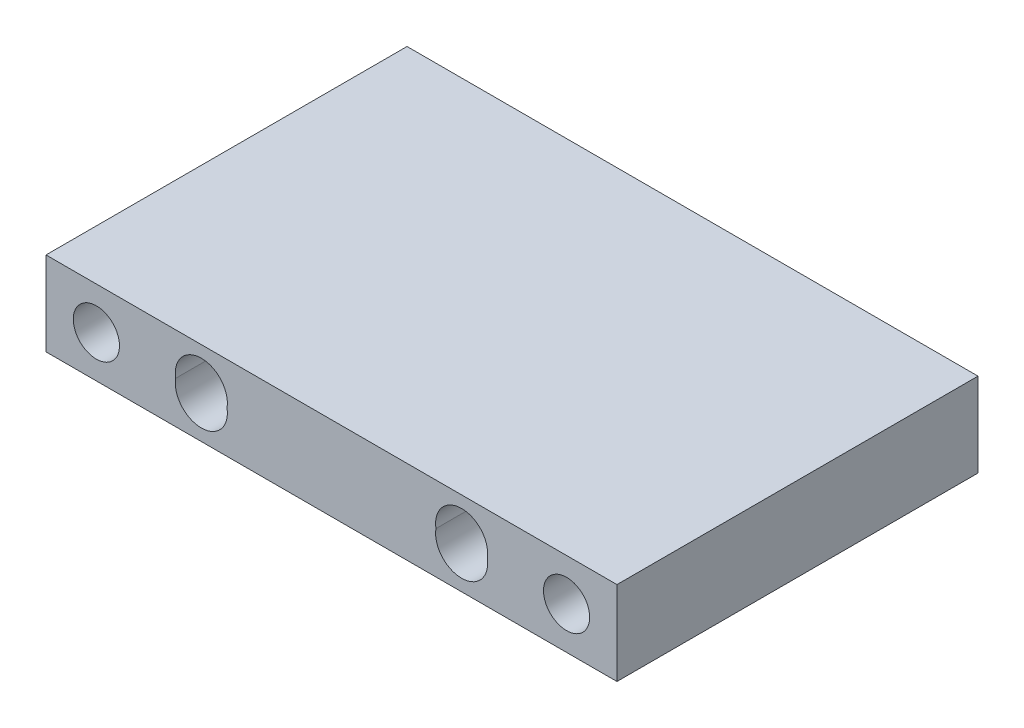
ISO-10303-21;
HEADER;
FILE_DESCRIPTION(('STEP AP214'),'2;1');
FILE_NAME('part.step','',(''),(''),'','','');
FILE_SCHEMA(('AUTOMOTIVE_DESIGN { 1 0 10303 214 1 1 1 1 }'));
ENDSEC;
DATA;
#1=APPLICATION_CONTEXT('core data for automotive mechanical design processes');
#2=APPLICATION_PROTOCOL_DEFINITION('international standard','automotive_design',2000,#1);
#3=PRODUCT_CONTEXT('',#1,'mechanical');
#4=PRODUCT('Part','Part','',(#3));
#5=PRODUCT_RELATED_PRODUCT_CATEGORY('part','',(#4));
#6=PRODUCT_DEFINITION_FORMATION('','',#4);
#7=PRODUCT_DEFINITION_CONTEXT('part definition',#1,'design');
#8=PRODUCT_DEFINITION('design','',#6,#7);
#9=PRODUCT_DEFINITION_SHAPE('','',#8);
#10=(LENGTH_UNIT() NAMED_UNIT(*) SI_UNIT(.MILLI.,.METRE.));
#11=(NAMED_UNIT(*) PLANE_ANGLE_UNIT() SI_UNIT($,.RADIAN.));
#12=(NAMED_UNIT(*) SI_UNIT($,.STERADIAN.) SOLID_ANGLE_UNIT());
#13=UNCERTAINTY_MEASURE_WITH_UNIT(LENGTH_MEASURE(1.E-05),#10,'distance_accuracy_value','');
#14=(GEOMETRIC_REPRESENTATION_CONTEXT(3) GLOBAL_UNCERTAINTY_ASSIGNED_CONTEXT((#13)) GLOBAL_UNIT_ASSIGNED_CONTEXT((#10,
#11,#12)) REPRESENTATION_CONTEXT('',''));
#15=CARTESIAN_POINT('',(0.,0.,0.));
#16=DIRECTION('',(0.,0.,1.));
#17=DIRECTION('',(1.,0.,0.));
#18=AXIS2_PLACEMENT_3D('',#15,#16,#17);
#19=CARTESIAN_POINT('',(28.,0.,-1.));
#20=DIRECTION('',(0.,0.,1.));
#21=DIRECTION('',(1.,0.,0.));
#22=AXIS2_PLACEMENT_3D('',#19,#20,#21);
#23=CYLINDRICAL_SURFACE('',#22,2.75);
#24=CARTESIAN_POINT('',(28.,0.,43.));
#25=DIRECTION('',(0.,0.,1.));
#26=DIRECTION('',(1.,0.,0.));
#27=AXIS2_PLACEMENT_3D('',#24,#25,#26);
#28=CIRCLE('',#27,2.75);
#29=CARTESIAN_POINT('',(30.75,0.,43.));
#30=VERTEX_POINT('',#29);
#31=EDGE_CURVE('E174',#30,#30,#28,.T.);
#32=ORIENTED_EDGE('',*,*,#31,.T.);
#33=EDGE_LOOP('',(#32));
#34=FACE_BOUND('',#33,.T.);
#35=CARTESIAN_POINT('',(28.,0.,0.));
#36=DIRECTION('',(0.,0.,1.));
#37=DIRECTION('',(1.,0.,0.));
#38=AXIS2_PLACEMENT_3D('',#35,#36,#37);
#39=CIRCLE('',#38,2.75);
#40=CARTESIAN_POINT('',(30.75,0.,0.));
#41=VERTEX_POINT('',#40);
#42=EDGE_CURVE('E201',#41,#41,#39,.T.);
#43=ORIENTED_EDGE('',*,*,#42,.F.);
#44=EDGE_LOOP('',(#43));
#45=FACE_BOUND('',#44,.T.);
#46=ADVANCED_FACE('F16',(#34,#45),#23,.F.);
#47=CARTESIAN_POINT('',(15.5,0.5,-1.));
#48=DIRECTION('',(0.,0.,1.));
#49=DIRECTION('',(1.,0.,0.));
#50=AXIS2_PLACEMENT_3D('',#47,#48,#49);
#51=CYLINDRICAL_SURFACE('',#50,3.1);
#52=DIRECTION('',(0.,0.,1.));
#53=VECTOR('',#52,1.);
#54=CARTESIAN_POINT('',(18.559411708156,0.,-1.));
#55=LINE('',#54,#53);
#56=CARTESIAN_POINT('',(18.559411708156,0.,0.));
#57=VERTEX_POINT('',#56);
#58=CARTESIAN_POINT('',(18.559411708156,0.,43.));
#59=VERTEX_POINT('',#58);
#60=EDGE_CURVE('E25',#57,#59,#55,.T.);
#61=ORIENTED_EDGE('',*,*,#60,.T.);
#62=CARTESIAN_POINT('',(15.5,0.5,43.));
#63=DIRECTION('',(0.,0.,-1.));
#64=DIRECTION('',(-0.986907002630809,-0.161290322580969,0.));
#65=AXIS2_PLACEMENT_3D('',#62,#63,#64);
#66=CIRCLE('',#65,3.1);
#67=CARTESIAN_POINT('',(12.440588291844,0.,43.));
#68=VERTEX_POINT('',#67);
#69=EDGE_CURVE('E152',#68,#59,#66,.T.);
#70=ORIENTED_EDGE('',*,*,#69,.F.);
#71=DIRECTION('',(0.,0.,1.));
#72=VECTOR('',#71,1.);
#73=CARTESIAN_POINT('',(12.440588291844,0.,-1.));
#74=LINE('',#73,#72);
#75=CARTESIAN_POINT('',(12.440588291844,0.,0.));
#76=VERTEX_POINT('',#75);
#77=EDGE_CURVE('E10',#76,#68,#74,.T.);
#78=ORIENTED_EDGE('',*,*,#77,.F.);
#79=CARTESIAN_POINT('',(15.5,0.5,0.));
#80=DIRECTION('',(0.,0.,1.));
#81=DIRECTION('',(0.986907002630809,-0.161290322580969,0.));
#82=AXIS2_PLACEMENT_3D('',#79,#80,#81);
#83=CIRCLE('',#82,3.1);
#84=EDGE_CURVE('E169',#57,#76,#83,.T.);
#85=ORIENTED_EDGE('',*,*,#84,.F.);
#86=EDGE_LOOP('',(#61,#70,#78,#85));
#87=FACE_BOUND('',#86,.T.);
#88=ADVANCED_FACE('F212',(#87),#51,.F.);
#89=CARTESIAN_POINT('',(15.5,-0.5,-1.));
#90=DIRECTION('',(0.,0.,1.));
#91=DIRECTION('',(1.,0.,0.));
#92=AXIS2_PLACEMENT_3D('',#89,#90,#91);
#93=CYLINDRICAL_SURFACE('',#92,3.1);
#94=ORIENTED_EDGE('',*,*,#60,.F.);
#95=CARTESIAN_POINT('',(15.5,-0.5,0.));
#96=DIRECTION('',(0.,0.,1.));
#97=DIRECTION('',(-0.986907002630809,0.161290322580969,0.));
#98=AXIS2_PLACEMENT_3D('',#95,#96,#97);
#99=CIRCLE('',#98,3.1);
#100=EDGE_CURVE('E165',#76,#57,#99,.T.);
#101=ORIENTED_EDGE('',*,*,#100,.F.);
#102=ORIENTED_EDGE('',*,*,#77,.T.);
#103=CARTESIAN_POINT('',(15.5,-0.5,43.));
#104=DIRECTION('',(0.,0.,-1.));
#105=DIRECTION('',(0.986907002630809,0.161290322580969,0.));
#106=AXIS2_PLACEMENT_3D('',#103,#104,#105);
#107=CIRCLE('',#106,3.1);
#108=EDGE_CURVE('E149',#59,#68,#107,.T.);
#109=ORIENTED_EDGE('',*,*,#108,.F.);
#110=EDGE_LOOP('',(#94,#101,#102,#109));
#111=FACE_BOUND('',#110,.T.);
#112=ADVANCED_FACE('F18',(#111),#93,.F.);
#113=CARTESIAN_POINT('',(-15.5,0.5,-1.));
#114=DIRECTION('',(0.,0.,1.));
#115=DIRECTION('',(1.,0.,0.));
#116=AXIS2_PLACEMENT_3D('',#113,#114,#115);
#117=CYLINDRICAL_SURFACE('',#116,3.1);
#118=DIRECTION('',(0.,0.,1.));
#119=VECTOR('',#118,1.);
#120=CARTESIAN_POINT('',(-12.44058829184,0.,-1.));
#121=LINE('',#120,#119);
#122=CARTESIAN_POINT('',(-12.44058829184,0.,0.));
#123=VERTEX_POINT('',#122);
#124=CARTESIAN_POINT('',(-12.44058829184,0.,43.));
#125=VERTEX_POINT('',#124);
#126=EDGE_CURVE('E205',#123,#125,#121,.T.);
#127=ORIENTED_EDGE('',*,*,#126,.T.);
#128=CARTESIAN_POINT('',(-15.5,0.5,43.));
#129=DIRECTION('',(0.,0.,-1.));
#130=DIRECTION('',(-0.986907002630809,-0.161290322580969,0.));
#131=AXIS2_PLACEMENT_3D('',#128,#129,#130);
#132=CIRCLE('',#131,3.1);
#133=CARTESIAN_POINT('',(-18.55941170815,0.,43.));
#134=VERTEX_POINT('',#133);
#135=EDGE_CURVE('E153',#134,#125,#132,.T.);
#136=ORIENTED_EDGE('',*,*,#135,.F.);
#137=DIRECTION('',(0.,0.,1.));
#138=VECTOR('',#137,1.);
#139=CARTESIAN_POINT('',(-18.55941170815,0.,-1.));
#140=LINE('',#139,#138);
#141=CARTESIAN_POINT('',(-18.55941170815,0.,0.));
#142=VERTEX_POINT('',#141);
#143=EDGE_CURVE('E208',#142,#134,#140,.T.);
#144=ORIENTED_EDGE('',*,*,#143,.F.);
#145=CARTESIAN_POINT('',(-15.5,0.5,0.));
#146=DIRECTION('',(0.,0.,1.));
#147=DIRECTION('',(0.986907002630809,-0.161290322580969,0.));
#148=AXIS2_PLACEMENT_3D('',#145,#146,#147);
#149=CIRCLE('',#148,3.1);
#150=EDGE_CURVE('E192',#123,#142,#149,.T.);
#151=ORIENTED_EDGE('',*,*,#150,.F.);
#152=EDGE_LOOP('',(#127,#136,#144,#151));
#153=FACE_BOUND('',#152,.T.);
#154=ADVANCED_FACE('F251',(#153),#117,.F.);
#155=CARTESIAN_POINT('',(-15.5,-0.5,-1.));
#156=DIRECTION('',(0.,0.,1.));
#157=DIRECTION('',(1.,0.,0.));
#158=AXIS2_PLACEMENT_3D('',#155,#156,#157);
#159=CYLINDRICAL_SURFACE('',#158,3.1);
#160=ORIENTED_EDGE('',*,*,#126,.F.);
#161=CARTESIAN_POINT('',(-15.5,-0.5,0.));
#162=DIRECTION('',(0.,0.,1.));
#163=DIRECTION('',(-0.986907002630809,0.161290322580969,0.));
#164=AXIS2_PLACEMENT_3D('',#161,#162,#163);
#165=CIRCLE('',#164,3.1);
#166=EDGE_CURVE('E170',#142,#123,#165,.T.);
#167=ORIENTED_EDGE('',*,*,#166,.F.);
#168=ORIENTED_EDGE('',*,*,#143,.T.);
#169=CARTESIAN_POINT('',(-15.5,-0.5,43.));
#170=DIRECTION('',(0.,0.,-1.));
#171=DIRECTION('',(0.986907002630809,0.161290322580969,0.));
#172=AXIS2_PLACEMENT_3D('',#169,#170,#171);
#173=CIRCLE('',#172,3.1);
#174=EDGE_CURVE('E145',#125,#134,#173,.T.);
#175=ORIENTED_EDGE('',*,*,#174,.F.);
#176=EDGE_LOOP('',(#160,#167,#168,#175));
#177=FACE_BOUND('',#176,.T.);
#178=ADVANCED_FACE('F237',(#177),#159,.F.);
#179=CARTESIAN_POINT('',(-28.,0.,-1.));
#180=DIRECTION('',(0.,0.,1.));
#181=DIRECTION('',(1.,0.,0.));
#182=AXIS2_PLACEMENT_3D('',#179,#180,#181);
#183=CYLINDRICAL_SURFACE('',#182,2.75);
#184=CARTESIAN_POINT('',(-28.,0.,43.));
#185=DIRECTION('',(0.,0.,1.));
#186=DIRECTION('',(1.,0.,0.));
#187=AXIS2_PLACEMENT_3D('',#184,#185,#186);
#188=CIRCLE('',#187,2.75);
#189=CARTESIAN_POINT('',(-25.25,0.,43.));
#190=VERTEX_POINT('',#189);
#191=EDGE_CURVE('E138',#190,#190,#188,.T.);
#192=ORIENTED_EDGE('',*,*,#191,.T.);
#193=EDGE_LOOP('',(#192));
#194=FACE_BOUND('',#193,.T.);
#195=CARTESIAN_POINT('',(-28.,0.,0.));
#196=DIRECTION('',(0.,0.,1.));
#197=DIRECTION('',(1.,0.,0.));
#198=AXIS2_PLACEMENT_3D('',#195,#196,#197);
#199=CIRCLE('',#198,2.75);
#200=CARTESIAN_POINT('',(-25.25,0.,0.));
#201=VERTEX_POINT('',#200);
#202=EDGE_CURVE('E188',#201,#201,#199,.T.);
#203=ORIENTED_EDGE('',*,*,#202,.F.);
#204=EDGE_LOOP('',(#203));
#205=FACE_BOUND('',#204,.T.);
#206=ADVANCED_FACE('F231',(#194,#205),#183,.F.);
#207=CARTESIAN_POINT('',(34.,-5.,0.));
#208=DIRECTION('',(1.,0.,0.));
#209=DIRECTION('',(0.,1.,0.));
#210=AXIS2_PLACEMENT_3D('',#207,#208,#209);
#211=PLANE('',#210);
#212=DIRECTION('',(0.,0.,1.));
#213=VECTOR('',#212,1.);
#214=CARTESIAN_POINT('',(34.,-5.,0.));
#215=LINE('',#214,#213);
#216=CARTESIAN_POINT('',(34.,-5.,0.));
#217=VERTEX_POINT('',#216);
#218=CARTESIAN_POINT('',(34.,-5.,43.));
#219=VERTEX_POINT('',#218);
#220=EDGE_CURVE('E110',#217,#219,#215,.T.);
#221=ORIENTED_EDGE('',*,*,#220,.F.);
#222=DIRECTION('',(0.,1.,0.));
#223=VECTOR('',#222,1.);
#224=CARTESIAN_POINT('',(34.,-5.,0.));
#225=LINE('',#224,#223);
#226=CARTESIAN_POINT('',(34.,5.,0.));
#227=VERTEX_POINT('',#226);
#228=EDGE_CURVE('E185',#217,#227,#225,.T.);
#229=ORIENTED_EDGE('',*,*,#228,.T.);
#230=DIRECTION('',(0.,0.,1.));
#231=VECTOR('',#230,1.);
#232=CARTESIAN_POINT('',(34.,5.,0.));
#233=LINE('',#232,#231);
#234=CARTESIAN_POINT('',(34.,5.,43.));
#235=VERTEX_POINT('',#234);
#236=EDGE_CURVE('E182',#227,#235,#233,.T.);
#237=ORIENTED_EDGE('',*,*,#236,.T.);
#238=DIRECTION('',(0.,1.,0.));
#239=VECTOR('',#238,1.);
#240=CARTESIAN_POINT('',(34.,-5.,43.));
#241=LINE('',#240,#239);
#242=EDGE_CURVE('E139',#219,#235,#241,.T.);
#243=ORIENTED_EDGE('',*,*,#242,.F.);
#244=EDGE_LOOP('',(#221,#229,#237,#243));
#245=FACE_BOUND('',#244,.T.);
#246=ADVANCED_FACE('F220',(#245),#211,.T.);
#247=CARTESIAN_POINT('',(-34.,-5.,0.));
#248=DIRECTION('',(0.,0.,1.));
#249=DIRECTION('',(1.,0.,0.));
#250=AXIS2_PLACEMENT_3D('',#247,#248,#249);
#251=PLANE('',#250);
#252=ORIENTED_EDGE('',*,*,#42,.T.);
#253=EDGE_LOOP('',(#252));
#254=FACE_BOUND('',#253,.T.);
#255=ORIENTED_EDGE('',*,*,#100,.T.);
#256=ORIENTED_EDGE('',*,*,#84,.T.);
#257=EDGE_LOOP('',(#255,#256));
#258=FACE_BOUND('',#257,.T.);
#259=ORIENTED_EDGE('',*,*,#150,.T.);
#260=ORIENTED_EDGE('',*,*,#166,.T.);
#261=EDGE_LOOP('',(#259,#260));
#262=FACE_BOUND('',#261,.T.);
#263=ORIENTED_EDGE('',*,*,#202,.T.);
#264=EDGE_LOOP('',(#263));
#265=FACE_BOUND('',#264,.T.);
#266=DIRECTION('',(1.,0.,0.));
#267=VECTOR('',#266,1.);
#268=CARTESIAN_POINT('',(-34.,5.,0.));
#269=LINE('',#268,#267);
#270=CARTESIAN_POINT('',(-34.,5.,0.));
#271=VERTEX_POINT('',#270);
#272=EDGE_CURVE('E178',#271,#227,#269,.T.);
#273=ORIENTED_EDGE('',*,*,#272,.T.);
#274=ORIENTED_EDGE('',*,*,#228,.F.);
#275=DIRECTION('',(1.,0.,0.));
#276=VECTOR('',#275,1.);
#277=CARTESIAN_POINT('',(-34.,-5.,0.));
#278=LINE('',#277,#276);
#279=CARTESIAN_POINT('',(-34.,-5.,0.));
#280=VERTEX_POINT('',#279);
#281=EDGE_CURVE('E115',#280,#217,#278,.T.);
#282=ORIENTED_EDGE('',*,*,#281,.F.);
#283=DIRECTION('',(0.,1.,0.));
#284=VECTOR('',#283,1.);
#285=CARTESIAN_POINT('',(-34.,-5.,0.));
#286=LINE('',#285,#284);
#287=EDGE_CURVE('E123',#280,#271,#286,.T.);
#288=ORIENTED_EDGE('',*,*,#287,.T.);
#289=EDGE_LOOP('',(#273,#274,#282,#288));
#290=FACE_BOUND('',#289,.T.);
#291=ADVANCED_FACE('F216',(#254,#258,#262,#265,#290),#251,.F.);
#292=CARTESIAN_POINT('',(-34.,5.,0.));
#293=DIRECTION('',(0.,1.,0.));
#294=DIRECTION('',(1.,0.,0.));
#295=AXIS2_PLACEMENT_3D('',#292,#293,#294);
#296=PLANE('',#295);
#297=ORIENTED_EDGE('',*,*,#272,.F.);
#298=DIRECTION('',(0.,0.,1.));
#299=VECTOR('',#298,1.);
#300=CARTESIAN_POINT('',(-34.,5.,0.));
#301=LINE('',#300,#299);
#302=CARTESIAN_POINT('',(-34.,5.,43.));
#303=VERTEX_POINT('',#302);
#304=EDGE_CURVE('E131',#271,#303,#301,.T.);
#305=ORIENTED_EDGE('',*,*,#304,.T.);
#306=DIRECTION('',(1.,0.,0.));
#307=VECTOR('',#306,1.);
#308=CARTESIAN_POINT('',(-34.,5.,43.));
#309=LINE('',#308,#307);
#310=EDGE_CURVE('E128',#303,#235,#309,.T.);
#311=ORIENTED_EDGE('',*,*,#310,.T.);
#312=ORIENTED_EDGE('',*,*,#236,.F.);
#313=EDGE_LOOP('',(#297,#305,#311,#312));
#314=FACE_BOUND('',#313,.T.);
#315=ADVANCED_FACE('F219',(#314),#296,.T.);
#316=CARTESIAN_POINT('',(-34.,-5.,43.));
#317=DIRECTION('',(0.,0.,1.));
#318=DIRECTION('',(1.,0.,0.));
#319=AXIS2_PLACEMENT_3D('',#316,#317,#318);
#320=PLANE('',#319);
#321=ORIENTED_EDGE('',*,*,#31,.F.);
#322=EDGE_LOOP('',(#321));
#323=FACE_BOUND('',#322,.T.);
#324=ORIENTED_EDGE('',*,*,#108,.T.);
#325=ORIENTED_EDGE('',*,*,#69,.T.);
#326=EDGE_LOOP('',(#324,#325));
#327=FACE_BOUND('',#326,.T.);
#328=ORIENTED_EDGE('',*,*,#174,.T.);
#329=ORIENTED_EDGE('',*,*,#135,.T.);
#330=EDGE_LOOP('',(#328,#329));
#331=FACE_BOUND('',#330,.T.);
#332=ORIENTED_EDGE('',*,*,#191,.F.);
#333=EDGE_LOOP('',(#332));
#334=FACE_BOUND('',#333,.T.);
#335=DIRECTION('',(0.,1.,0.));
#336=VECTOR('',#335,1.);
#337=CARTESIAN_POINT('',(-34.,-5.,43.));
#338=LINE('',#337,#336);
#339=CARTESIAN_POINT('',(-34.,-5.,43.));
#340=VERTEX_POINT('',#339);
#341=EDGE_CURVE('E121',#340,#303,#338,.T.);
#342=ORIENTED_EDGE('',*,*,#341,.F.);
#343=DIRECTION('',(1.,0.,0.));
#344=VECTOR('',#343,1.);
#345=CARTESIAN_POINT('',(-34.,-5.,43.));
#346=LINE('',#345,#344);
#347=EDGE_CURVE('E103',#340,#219,#346,.T.);
#348=ORIENTED_EDGE('',*,*,#347,.T.);
#349=ORIENTED_EDGE('',*,*,#242,.T.);
#350=ORIENTED_EDGE('',*,*,#310,.F.);
#351=EDGE_LOOP('',(#342,#348,#349,#350));
#352=FACE_BOUND('',#351,.T.);
#353=ADVANCED_FACE('F126',(#323,#327,#331,#334,#352),#320,.T.);
#354=CARTESIAN_POINT('',(-34.,-5.,0.));
#355=DIRECTION('',(0.,1.,0.));
#356=DIRECTION('',(1.,0.,0.));
#357=AXIS2_PLACEMENT_3D('',#354,#355,#356);
#358=PLANE('',#357);
#359=ORIENTED_EDGE('',*,*,#220,.T.);
#360=ORIENTED_EDGE('',*,*,#347,.F.);
#361=DIRECTION('',(0.,0.,1.));
#362=VECTOR('',#361,1.);
#363=CARTESIAN_POINT('',(-34.,-5.,0.));
#364=LINE('',#363,#362);
#365=EDGE_CURVE('E107',#280,#340,#364,.T.);
#366=ORIENTED_EDGE('',*,*,#365,.F.);
#367=ORIENTED_EDGE('',*,*,#281,.T.);
#368=EDGE_LOOP('',(#359,#360,#366,#367));
#369=FACE_BOUND('',#368,.T.);
#370=ADVANCED_FACE('F105',(#369),#358,.F.);
#371=CARTESIAN_POINT('',(-34.,-5.,0.));
#372=DIRECTION('',(1.,0.,0.));
#373=DIRECTION('',(0.,1.,0.));
#374=AXIS2_PLACEMENT_3D('',#371,#372,#373);
#375=PLANE('',#374);
#376=ORIENTED_EDGE('',*,*,#341,.T.);
#377=ORIENTED_EDGE('',*,*,#304,.F.);
#378=ORIENTED_EDGE('',*,*,#287,.F.);
#379=ORIENTED_EDGE('',*,*,#365,.T.);
#380=EDGE_LOOP('',(#376,#377,#378,#379));
#381=FACE_BOUND('',#380,.T.);
#382=ADVANCED_FACE('F119',(#381),#375,.F.);
#383=CLOSED_SHELL('',(#46,#88,#112,#154,#178,#206,#246,#291,#315,#353,#370,#382));
#384=MANIFOLD_SOLID_BREP('B1',#383);
#385=ADVANCED_BREP_SHAPE_REPRESENTATION('',(#18,#384),#14);
#386=SHAPE_DEFINITION_REPRESENTATION(#9,#385);
ENDSEC;
END-ISO-10303-21;
